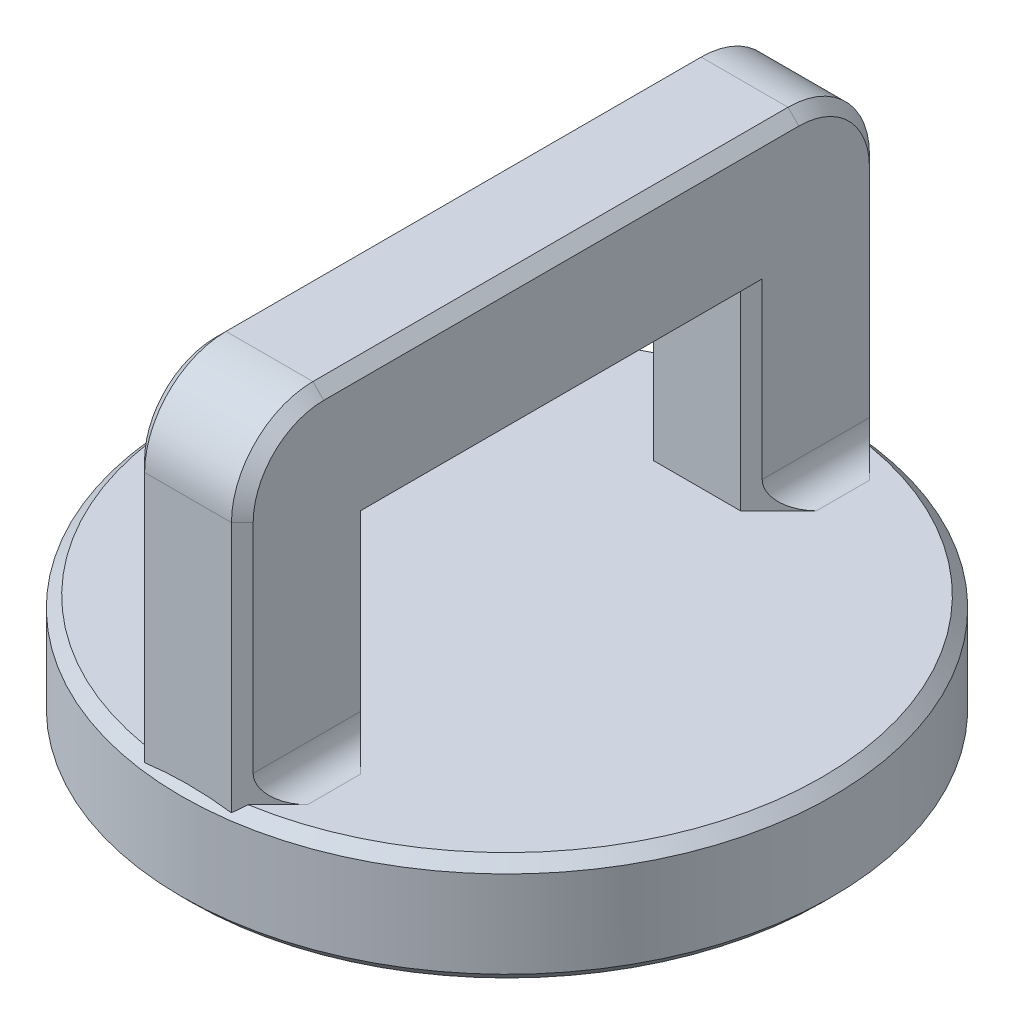
ISO-10303-21;
HEADER;
FILE_DESCRIPTION(('STEP AP214'),'2;1');
FILE_NAME('part.step','',(''),(''),'','','');
FILE_SCHEMA(('AUTOMOTIVE_DESIGN { 1 0 10303 214 1 1 1 1 }'));
ENDSEC;
DATA;
#1=APPLICATION_CONTEXT('core data for automotive mechanical design processes');
#2=APPLICATION_PROTOCOL_DEFINITION('international standard','automotive_design',2000,#1);
#3=PRODUCT_CONTEXT('',#1,'mechanical');
#4=PRODUCT('Part','Part','',(#3));
#5=PRODUCT_RELATED_PRODUCT_CATEGORY('part','',(#4));
#6=PRODUCT_DEFINITION_FORMATION('','',#4);
#7=PRODUCT_DEFINITION_CONTEXT('part definition',#1,'design');
#8=PRODUCT_DEFINITION('design','',#6,#7);
#9=PRODUCT_DEFINITION_SHAPE('','',#8);
#10=(LENGTH_UNIT() NAMED_UNIT(*) SI_UNIT(.MILLI.,.METRE.));
#11=(NAMED_UNIT(*) PLANE_ANGLE_UNIT() SI_UNIT($,.RADIAN.));
#12=(NAMED_UNIT(*) SI_UNIT($,.STERADIAN.) SOLID_ANGLE_UNIT());
#13=UNCERTAINTY_MEASURE_WITH_UNIT(LENGTH_MEASURE(1.E-05),#10,'distance_accuracy_value','');
#14=(GEOMETRIC_REPRESENTATION_CONTEXT(3) GLOBAL_UNCERTAINTY_ASSIGNED_CONTEXT((#13)) GLOBAL_UNIT_ASSIGNED_CONTEXT((#10,
#11,#12)) REPRESENTATION_CONTEXT('',''));
#15=CARTESIAN_POINT('',(0.,0.,0.));
#16=DIRECTION('',(0.,0.,1.));
#17=DIRECTION('',(1.,0.,0.));
#18=AXIS2_PLACEMENT_3D('',#15,#16,#17);
#19=CARTESIAN_POINT('',(0.,4.,0.));
#20=DIRECTION('',(0.,-1.,0.));
#21=DIRECTION('',(0.,0.,-1.));
#22=AXIS2_PLACEMENT_3D('',#19,#20,#21);
#23=CYLINDRICAL_SURFACE('',#22,12.);
#24=CARTESIAN_POINT('',(0.,3.6,0.));
#25=DIRECTION('',(0.,1.,0.));
#26=DIRECTION('',(0.,0.,1.));
#27=AXIS2_PLACEMENT_3D('',#24,#25,#26);
#28=CIRCLE('',#27,12.);
#29=CARTESIAN_POINT('',(0.,3.6,12.));
#30=VERTEX_POINT('',#29);
#31=EDGE_CURVE('E647',#30,#30,#28,.F.);
#32=ORIENTED_EDGE('',*,*,#31,.T.);
#33=EDGE_LOOP('',(#32));
#34=FACE_BOUND('',#33,.T.);
#35=CARTESIAN_POINT('',(0.,0.399999999999998,0.));
#36=DIRECTION('',(0.,1.,0.));
#37=DIRECTION('',(0.,0.,1.));
#38=AXIS2_PLACEMENT_3D('',#35,#36,#37);
#39=CIRCLE('',#38,12.);
#40=CARTESIAN_POINT('',(0.,0.399999999999998,12.));
#41=VERTEX_POINT('',#40);
#42=EDGE_CURVE('E639',#41,#41,#39,.T.);
#43=ORIENTED_EDGE('',*,*,#42,.T.);
#44=EDGE_LOOP('',(#43));
#45=FACE_BOUND('',#44,.T.);
#46=ADVANCED_FACE('F37',(#34,#45),#23,.T.);
#47=CARTESIAN_POINT('',(0.,4.,0.));
#48=DIRECTION('',(0.,1.,0.));
#49=DIRECTION('',(0.,0.,1.));
#50=AXIS2_PLACEMENT_3D('',#47,#48,#49);
#51=PLANE('',#50);
#52=DIRECTION('',(-0.707106781186546,0.,-0.707106781186549));
#53=VECTOR('',#52,1.);
#54=CARTESIAN_POINT('',(1.6,4.,-11.75));
#55=LINE('',#54,#53);
#56=CARTESIAN_POINT('',(1.90799097966031,4.,-11.4420090203397));
#57=VERTEX_POINT('',#56);
#58=CARTESIAN_POINT('',(3.,4.,-10.35));
#59=VERTEX_POINT('',#58);
#60=EDGE_CURVE('E506',#57,#59,#55,.F.);
#61=ORIENTED_EDGE('',*,*,#60,.T.);
#62=DIRECTION('',(0.,0.,-1.));
#63=VECTOR('',#62,1.);
#64=CARTESIAN_POINT('',(3.,4.,0.));
#65=LINE('',#64,#63);
#66=CARTESIAN_POINT('',(3.,4.,-8.4));
#67=VERTEX_POINT('',#66);
#68=EDGE_CURVE('E477',#59,#67,#65,.F.);
#69=ORIENTED_EDGE('',*,*,#68,.T.);
#70=DIRECTION('',(0.707106781186549,0.,-0.707106781186546));
#71=VECTOR('',#70,1.);
#72=CARTESIAN_POINT('',(2.,4.,-7.4));
#73=LINE('',#72,#71);
#74=CARTESIAN_POINT('',(1.6,4.,-7.));
#75=VERTEX_POINT('',#74);
#76=EDGE_CURVE('E503',#67,#75,#73,.F.);
#77=ORIENTED_EDGE('',*,*,#76,.T.);
#78=DIRECTION('',(-1.,0.,0.));
#79=VECTOR('',#78,1.);
#80=CARTESIAN_POINT('',(22.,4.,-7.));
#81=LINE('',#80,#79);
#82=CARTESIAN_POINT('',(-1.6,4.,-7.));
#83=VERTEX_POINT('',#82);
#84=EDGE_CURVE('E447',#75,#83,#81,.T.);
#85=ORIENTED_EDGE('',*,*,#84,.T.);
#86=DIRECTION('',(0.707106781186546,0.,0.707106781186549));
#87=VECTOR('',#86,1.);
#88=CARTESIAN_POINT('',(-1.6,4.,-7.));
#89=LINE('',#88,#87);
#90=CARTESIAN_POINT('',(-3.,4.,-8.40000000000001));
#91=VERTEX_POINT('',#90);
#92=EDGE_CURVE('E439',#83,#91,#89,.F.);
#93=ORIENTED_EDGE('',*,*,#92,.T.);
#94=DIRECTION('',(0.,0.,1.));
#95=VECTOR('',#94,1.);
#96=CARTESIAN_POINT('',(-3.,4.,0.));
#97=LINE('',#96,#95);
#98=CARTESIAN_POINT('',(-3.,4.,-10.35));
#99=VERTEX_POINT('',#98);
#100=EDGE_CURVE('E468',#91,#99,#97,.F.);
#101=ORIENTED_EDGE('',*,*,#100,.T.);
#102=DIRECTION('',(-0.707106781186546,0.,0.707106781186549));
#103=VECTOR('',#102,1.);
#104=CARTESIAN_POINT('',(-2.,4.,-11.35));
#105=LINE('',#104,#103);
#106=CARTESIAN_POINT('',(-1.90799097966031,4.,-11.4420090203397));
#107=VERTEX_POINT('',#106);
#108=EDGE_CURVE('E302',#99,#107,#105,.F.);
#109=ORIENTED_EDGE('',*,*,#108,.T.);
#110=CARTESIAN_POINT('',(0.,4.,0.));
#111=DIRECTION('',(0.,1.,0.));
#112=DIRECTION('',(0.,0.,1.));
#113=AXIS2_PLACEMENT_3D('',#110,#111,#112);
#114=CIRCLE('',#113,11.6);
#115=CARTESIAN_POINT('',(-1.9079909796603,4.,11.4420090203397));
#116=VERTEX_POINT('',#115);
#117=EDGE_CURVE('E646',#107,#116,#114,.T.);
#118=ORIENTED_EDGE('',*,*,#117,.T.);
#119=DIRECTION('',(0.707106781186544,0.,0.707106781186551));
#120=VECTOR('',#119,1.);
#121=CARTESIAN_POINT('',(-1.6,4.,11.75));
#122=LINE('',#121,#120);
#123=CARTESIAN_POINT('',(-3.,4.,10.35));
#124=VERTEX_POINT('',#123);
#125=EDGE_CURVE('E518',#116,#124,#122,.F.);
#126=ORIENTED_EDGE('',*,*,#125,.T.);
#127=DIRECTION('',(0.,0.,1.));
#128=VECTOR('',#127,1.);
#129=CARTESIAN_POINT('',(-3.,4.,0.));
#130=LINE('',#129,#128);
#131=CARTESIAN_POINT('',(-3.,4.,8.40000000000001));
#132=VERTEX_POINT('',#131);
#133=EDGE_CURVE('E471',#124,#132,#130,.F.);
#134=ORIENTED_EDGE('',*,*,#133,.T.);
#135=DIRECTION('',(-0.707106781186545,0.,0.70710678118655));
#136=VECTOR('',#135,1.);
#137=CARTESIAN_POINT('',(-1.6,4.,7.));
#138=LINE('',#137,#136);
#139=CARTESIAN_POINT('',(-1.6,4.,7.));
#140=VERTEX_POINT('',#139);
#141=EDGE_CURVE('E499',#132,#140,#138,.F.);
#142=ORIENTED_EDGE('',*,*,#141,.T.);
#143=DIRECTION('',(-1.,0.,0.));
#144=VECTOR('',#143,1.);
#145=CARTESIAN_POINT('',(22.,4.,7.));
#146=LINE('',#145,#144);
#147=CARTESIAN_POINT('',(1.6,4.,7.));
#148=VERTEX_POINT('',#147);
#149=EDGE_CURVE('E669',#148,#140,#146,.T.);
#150=ORIENTED_EDGE('',*,*,#149,.F.);
#151=DIRECTION('',(-0.707106781186547,0.,-0.707106781186548));
#152=VECTOR('',#151,1.);
#153=CARTESIAN_POINT('',(2.,4.,7.4));
#154=LINE('',#153,#152);
#155=CARTESIAN_POINT('',(3.,4.,8.4));
#156=VERTEX_POINT('',#155);
#157=EDGE_CURVE('E500',#148,#156,#154,.F.);
#158=ORIENTED_EDGE('',*,*,#157,.T.);
#159=DIRECTION('',(0.,0.,-1.));
#160=VECTOR('',#159,1.);
#161=CARTESIAN_POINT('',(3.,4.,0.));
#162=LINE('',#161,#160);
#163=CARTESIAN_POINT('',(3.,4.,10.35));
#164=VERTEX_POINT('',#163);
#165=EDGE_CURVE('E474',#156,#164,#162,.F.);
#166=ORIENTED_EDGE('',*,*,#165,.T.);
#167=DIRECTION('',(0.707106781186548,0.,-0.707106781186548));
#168=VECTOR('',#167,1.);
#169=CARTESIAN_POINT('',(2.,4.,11.35));
#170=LINE('',#169,#168);
#171=CARTESIAN_POINT('',(1.90799097966031,4.,11.4420090203397));
#172=VERTEX_POINT('',#171);
#173=EDGE_CURVE('E513',#164,#172,#170,.F.);
#174=ORIENTED_EDGE('',*,*,#173,.T.);
#175=CARTESIAN_POINT('',(0.,4.,0.));
#176=DIRECTION('',(0.,1.,0.));
#177=DIRECTION('',(0.,0.,1.));
#178=AXIS2_PLACEMENT_3D('',#175,#176,#177);
#179=CIRCLE('',#178,11.6);
#180=EDGE_CURVE('E644',#172,#57,#179,.T.);
#181=ORIENTED_EDGE('',*,*,#180,.T.);
#182=EDGE_LOOP('',(#61,#69,#77,#85,#93,#101,#109,#118,#126,#134,#142,#150,#158,#166,#174,#181));
#183=FACE_BOUND('',#182,.T.);
#184=ADVANCED_FACE('F384',(#183),#51,.T.);
#185=CARTESIAN_POINT('',(0.,0.,0.));
#186=DIRECTION('',(0.,1.,0.));
#187=DIRECTION('',(0.,0.,1.));
#188=AXIS2_PLACEMENT_3D('',#185,#186,#187);
#189=PLANE('',#188);
#190=CARTESIAN_POINT('',(0.,0.,0.));
#191=DIRECTION('',(0.,1.,0.));
#192=DIRECTION('',(0.,0.,1.));
#193=AXIS2_PLACEMENT_3D('',#190,#191,#192);
#194=CIRCLE('',#193,11.6);
#195=CARTESIAN_POINT('',(0.,0.,11.6));
#196=VERTEX_POINT('',#195);
#197=EDGE_CURVE('E635',#196,#196,#194,.F.);
#198=ORIENTED_EDGE('',*,*,#197,.T.);
#199=EDGE_LOOP('',(#198));
#200=FACE_BOUND('',#199,.T.);
#201=ADVANCED_FACE('F383',(#200),#189,.F.);
#202=CARTESIAN_POINT('',(-2.,16.,-11.75));
#203=DIRECTION('',(1.,0.,0.));
#204=DIRECTION('',(0.,0.,-1.));
#205=AXIS2_PLACEMENT_3D('',#202,#203,#204);
#206=PLANE('',#205);
#207=DIRECTION('',(0.,-1.,0.));
#208=VECTOR('',#207,1.);
#209=CARTESIAN_POINT('',(-2.,16.,7.4));
#210=LINE('',#209,#208);
#211=CARTESIAN_POINT('',(-2.,11.4,7.40000000000001));
#212=VERTEX_POINT('',#211);
#213=CARTESIAN_POINT('',(-2.,5.,7.40000000000001));
#214=VERTEX_POINT('',#213);
#215=EDGE_CURVE('E237',#212,#214,#210,.T.);
#216=ORIENTED_EDGE('',*,*,#215,.T.);
#217=DIRECTION('',(0.,0.,1.));
#218=VECTOR('',#217,1.);
#219=CARTESIAN_POINT('',(-2.,5.,-11.75));
#220=LINE('',#219,#218);
#221=CARTESIAN_POINT('',(-2.,5.,11.35));
#222=VERTEX_POINT('',#221);
#223=EDGE_CURVE('E481',#214,#222,#220,.T.);
#224=ORIENTED_EDGE('',*,*,#223,.T.);
#225=DIRECTION('',(0.,1.,0.));
#226=VECTOR('',#225,1.);
#227=CARTESIAN_POINT('',(-2.,16.,11.35));
#228=LINE('',#227,#226);
#229=CARTESIAN_POINT('',(-2.,13.,11.35));
#230=VERTEX_POINT('',#229);
#231=EDGE_CURVE('E248',#222,#230,#228,.T.);
#232=ORIENTED_EDGE('',*,*,#231,.T.);
#233=CARTESIAN_POINT('',(-2.,13.,8.75));
#234=DIRECTION('',(1.,0.,0.));
#235=DIRECTION('',(0.,0.,-1.));
#236=AXIS2_PLACEMENT_3D('',#233,#234,#235);
#237=CIRCLE('',#236,2.6);
#238=CARTESIAN_POINT('',(-2.,15.6,8.75));
#239=VERTEX_POINT('',#238);
#240=EDGE_CURVE('E244',#230,#239,#237,.F.);
#241=ORIENTED_EDGE('',*,*,#240,.T.);
#242=DIRECTION('',(0.,0.,-1.));
#243=VECTOR('',#242,1.);
#244=CARTESIAN_POINT('',(-2.,15.6,-8.75));
#245=LINE('',#244,#243);
#246=CARTESIAN_POINT('',(-2.,15.6,-8.75));
#247=VERTEX_POINT('',#246);
#248=EDGE_CURVE('E239',#239,#247,#245,.T.);
#249=ORIENTED_EDGE('',*,*,#248,.T.);
#250=CARTESIAN_POINT('',(-2.,13.,-8.75));
#251=DIRECTION('',(1.,0.,0.));
#252=DIRECTION('',(0.,0.,-1.));
#253=AXIS2_PLACEMENT_3D('',#250,#251,#252);
#254=CIRCLE('',#253,2.6);
#255=CARTESIAN_POINT('',(-2.,13.,-11.35));
#256=VERTEX_POINT('',#255);
#257=EDGE_CURVE('E246',#247,#256,#254,.F.);
#258=ORIENTED_EDGE('',*,*,#257,.T.);
#259=DIRECTION('',(0.,-1.,0.));
#260=VECTOR('',#259,1.);
#261=CARTESIAN_POINT('',(-2.,16.,-11.35));
#262=LINE('',#261,#260);
#263=CARTESIAN_POINT('',(-2.,5.,-11.35));
#264=VERTEX_POINT('',#263);
#265=EDGE_CURVE('E250',#256,#264,#262,.T.);
#266=ORIENTED_EDGE('',*,*,#265,.T.);
#267=DIRECTION('',(0.,0.,1.));
#268=VECTOR('',#267,1.);
#269=CARTESIAN_POINT('',(-2.,5.,-11.75));
#270=LINE('',#269,#268);
#271=CARTESIAN_POINT('',(-2.,5.,-7.4));
#272=VERTEX_POINT('',#271);
#273=EDGE_CURVE('E219',#264,#272,#270,.T.);
#274=ORIENTED_EDGE('',*,*,#273,.T.);
#275=DIRECTION('',(0.,1.,0.));
#276=VECTOR('',#275,1.);
#277=CARTESIAN_POINT('',(-2.,16.,-7.4));
#278=LINE('',#277,#276);
#279=CARTESIAN_POINT('',(-2.,11.4,-7.4));
#280=VERTEX_POINT('',#279);
#281=EDGE_CURVE('E212',#272,#280,#278,.T.);
#282=ORIENTED_EDGE('',*,*,#281,.T.);
#283=DIRECTION('',(0.,0.,1.));
#284=VECTOR('',#283,1.);
#285=CARTESIAN_POINT('',(-2.,11.4,-11.75));
#286=LINE('',#285,#284);
#287=EDGE_CURVE('E216',#280,#212,#286,.T.);
#288=ORIENTED_EDGE('',*,*,#287,.T.);
#289=EDGE_LOOP('',(#216,#224,#232,#241,#249,#258,#266,#274,#282,#288));
#290=FACE_BOUND('',#289,.T.);
#291=ADVANCED_FACE('F214',(#290),#206,.F.);
#292=CARTESIAN_POINT('',(-2.,16.,11.75));
#293=DIRECTION('',(0.,0.,-1.));
#294=DIRECTION('',(-1.,0.,0.));
#295=AXIS2_PLACEMENT_3D('',#292,#293,#294);
#296=PLANE('',#295);
#297=DIRECTION('',(1.,0.,0.));
#298=VECTOR('',#297,1.);
#299=CARTESIAN_POINT('',(-2.,13.,11.75));
#300=LINE('',#299,#298);
#301=CARTESIAN_POINT('',(1.6,13.,11.75));
#302=VERTEX_POINT('',#301);
#303=CARTESIAN_POINT('',(-1.6,13.,11.75));
#304=VERTEX_POINT('',#303);
#305=EDGE_CURVE('E415',#302,#304,#300,.F.);
#306=ORIENTED_EDGE('',*,*,#305,.T.);
#307=DIRECTION('',(0.,-1.,0.));
#308=VECTOR('',#307,1.);
#309=CARTESIAN_POINT('',(-1.6,16.,11.75));
#310=LINE('',#309,#308);
#311=CARTESIAN_POINT('',(-1.6,3.74156418409241,11.75));
#312=VERTEX_POINT('',#311);
#313=EDGE_CURVE('E258',#304,#312,#310,.T.);
#314=ORIENTED_EDGE('',*,*,#313,.T.);
#315=CARTESIAN_POINT('',(-2.,3.68100255893979,11.75));
#316=CARTESIAN_POINT('',(-1.85360198840346,3.70557192127635,11.75));
#317=CARTESIAN_POINT('',(-1.70678381389868,3.72758153810895,11.75));
#318=CARTESIAN_POINT('',(-1.41244071645743,3.76631035297485,11.75));
#319=CARTESIAN_POINT('',(-1.26491573978375,3.78302914206022,11.75));
#320=CARTESIAN_POINT('',(-0.82146209920867,3.82499272518919,11.75));
#321=CARTESIAN_POINT('',(-0.524707290062936,3.84203580663085,11.75));
#322=CARTESIAN_POINT('',(0.0656232447160099,3.85348065017774,11.75));
#323=CARTESIAN_POINT('',(0.359194163305538,3.84815290788293,11.75));
#324=CARTESIAN_POINT('',(0.944999599016471,3.81568510032264,11.75));
#325=CARTESIAN_POINT('',(1.23723475795835,3.78855693894607,11.75));
#326=CARTESIAN_POINT('',(1.60685592880795,3.74089588109145,11.75));
#327=CARTESIAN_POINT('',(1.68556281533893,3.72997180538805,11.75));
#328=CARTESIAN_POINT('',(1.84288577430954,3.7066119951146,11.75));
#329=CARTESIAN_POINT('',(1.92150147821086,3.69417377751516,11.75));
#330=CARTESIAN_POINT('',(2.,3.68100255893979,11.75));
#331=B_SPLINE_CURVE_WITH_KNOTS('',3,(#315,#316,#317,#318,#319,#320,#321,#322,#323,#324,#325,
#326,#327,#328,#329,#330),.UNSPECIFIED.,.F.,.F.,(4,2,2,2,2,2,2,4),(0.,0.445291792412324,
0.890617994697423,1.78142996879038,2.66150195239136,3.54109370823164,3.77946970153538,
4.01824200941105),.UNSPECIFIED.);
#332=CARTESIAN_POINT('',(1.6,3.74156418409241,11.75));
#333=VERTEX_POINT('',#332);
#334=EDGE_CURVE('E351',#312,#333,#331,.T.);
#335=ORIENTED_EDGE('',*,*,#334,.T.);
#336=DIRECTION('',(0.,1.,0.));
#337=VECTOR('',#336,1.);
#338=CARTESIAN_POINT('',(1.6,16.,11.75));
#339=LINE('',#338,#337);
#340=EDGE_CURVE('E256',#333,#302,#339,.T.);
#341=ORIENTED_EDGE('',*,*,#340,.T.);
#342=EDGE_LOOP('',(#306,#314,#335,#341));
#343=FACE_BOUND('',#342,.T.);
#344=ADVANCED_FACE('F375',(#343),#296,.F.);
#345=CARTESIAN_POINT('',(2.,16.,-11.75));
#346=DIRECTION('',(-1.,0.,0.));
#347=DIRECTION('',(0.,0.,1.));
#348=AXIS2_PLACEMENT_3D('',#345,#346,#347);
#349=PLANE('',#348);
#350=DIRECTION('',(0.,-1.,0.));
#351=VECTOR('',#350,1.);
#352=CARTESIAN_POINT('',(2.,16.,-7.4));
#353=LINE('',#352,#351);
#354=CARTESIAN_POINT('',(2.,11.4,-7.4));
#355=VERTEX_POINT('',#354);
#356=CARTESIAN_POINT('',(2.,5.,-7.4));
#357=VERTEX_POINT('',#356);
#358=EDGE_CURVE('E276',#355,#357,#353,.T.);
#359=ORIENTED_EDGE('',*,*,#358,.T.);
#360=DIRECTION('',(0.,0.,-1.));
#361=VECTOR('',#360,1.);
#362=CARTESIAN_POINT('',(2.,5.,-11.75));
#363=LINE('',#362,#361);
#364=CARTESIAN_POINT('',(2.,5.,-11.35));
#365=VERTEX_POINT('',#364);
#366=EDGE_CURVE('E465',#357,#365,#363,.T.);
#367=ORIENTED_EDGE('',*,*,#366,.T.);
#368=DIRECTION('',(0.,1.,0.));
#369=VECTOR('',#368,1.);
#370=CARTESIAN_POINT('',(2.,16.,-11.35));
#371=LINE('',#370,#369);
#372=CARTESIAN_POINT('',(2.,13.,-11.35));
#373=VERTEX_POINT('',#372);
#374=EDGE_CURVE('E285',#365,#373,#371,.T.);
#375=ORIENTED_EDGE('',*,*,#374,.T.);
#376=CARTESIAN_POINT('',(2.,13.,-8.75));
#377=DIRECTION('',(-1.,0.,0.));
#378=DIRECTION('',(0.,0.,1.));
#379=AXIS2_PLACEMENT_3D('',#376,#377,#378);
#380=CIRCLE('',#379,2.6);
#381=CARTESIAN_POINT('',(2.,15.6,-8.75));
#382=VERTEX_POINT('',#381);
#383=EDGE_CURVE('E281',#373,#382,#380,.F.);
#384=ORIENTED_EDGE('',*,*,#383,.T.);
#385=DIRECTION('',(0.,0.,1.));
#386=VECTOR('',#385,1.);
#387=CARTESIAN_POINT('',(2.,15.6,8.75));
#388=LINE('',#387,#386);
#389=CARTESIAN_POINT('',(2.,15.6,8.75));
#390=VERTEX_POINT('',#389);
#391=EDGE_CURVE('E279',#382,#390,#388,.T.);
#392=ORIENTED_EDGE('',*,*,#391,.T.);
#393=CARTESIAN_POINT('',(2.,13.,8.75));
#394=DIRECTION('',(-1.,0.,0.));
#395=DIRECTION('',(0.,0.,1.));
#396=AXIS2_PLACEMENT_3D('',#393,#394,#395);
#397=CIRCLE('',#396,2.6);
#398=CARTESIAN_POINT('',(2.,13.,11.35));
#399=VERTEX_POINT('',#398);
#400=EDGE_CURVE('E283',#390,#399,#397,.F.);
#401=ORIENTED_EDGE('',*,*,#400,.T.);
#402=DIRECTION('',(0.,-1.,0.));
#403=VECTOR('',#402,1.);
#404=CARTESIAN_POINT('',(2.,16.,11.35));
#405=LINE('',#404,#403);
#406=CARTESIAN_POINT('',(2.,5.,11.35));
#407=VERTEX_POINT('',#406);
#408=EDGE_CURVE('E287',#399,#407,#405,.T.);
#409=ORIENTED_EDGE('',*,*,#408,.T.);
#410=DIRECTION('',(0.,0.,-1.));
#411=VECTOR('',#410,1.);
#412=CARTESIAN_POINT('',(2.,5.,-11.75));
#413=LINE('',#412,#411);
#414=CARTESIAN_POINT('',(2.,5.,7.4));
#415=VERTEX_POINT('',#414);
#416=EDGE_CURVE('E462',#407,#415,#413,.T.);
#417=ORIENTED_EDGE('',*,*,#416,.T.);
#418=DIRECTION('',(0.,1.,0.));
#419=VECTOR('',#418,1.);
#420=CARTESIAN_POINT('',(2.,16.,7.4));
#421=LINE('',#420,#419);
#422=CARTESIAN_POINT('',(2.,11.4,7.4));
#423=VERTEX_POINT('',#422);
#424=EDGE_CURVE('E272',#415,#423,#421,.T.);
#425=ORIENTED_EDGE('',*,*,#424,.T.);
#426=DIRECTION('',(0.,0.,-1.));
#427=VECTOR('',#426,1.);
#428=CARTESIAN_POINT('',(2.,11.4,-11.75));
#429=LINE('',#428,#427);
#430=EDGE_CURVE('E274',#423,#355,#429,.T.);
#431=ORIENTED_EDGE('',*,*,#430,.T.);
#432=EDGE_LOOP('',(#359,#367,#375,#384,#392,#401,#409,#417,#425,#431));
#433=FACE_BOUND('',#432,.T.);
#434=ADVANCED_FACE('F371',(#433),#349,.F.);
#435=CARTESIAN_POINT('',(-2.,16.,-11.75));
#436=DIRECTION('',(0.,0.,1.));
#437=DIRECTION('',(1.,0.,0.));
#438=AXIS2_PLACEMENT_3D('',#435,#436,#437);
#439=PLANE('',#438);
#440=CARTESIAN_POINT('',(2.,3.68100255893979,-11.75));
#441=CARTESIAN_POINT('',(1.85360198840346,3.70557192127635,-11.75));
#442=CARTESIAN_POINT('',(1.70678381389868,3.72758153810895,-11.75));
#443=CARTESIAN_POINT('',(1.41244071645742,3.76631035297485,-11.75));
#444=CARTESIAN_POINT('',(1.26491573978375,3.78302914206022,-11.75));
#445=CARTESIAN_POINT('',(0.821462099208669,3.82499272518919,-11.75));
#446=CARTESIAN_POINT('',(0.524707290062936,3.84203580663085,-11.75));
#447=CARTESIAN_POINT('',(-0.0656232447160104,3.85348065017774,-11.75));
#448=CARTESIAN_POINT('',(-0.359194163305538,3.84815290788293,-11.75));
#449=CARTESIAN_POINT('',(-0.944999599016471,3.81568510032264,-11.75));
#450=CARTESIAN_POINT('',(-1.23723475795835,3.78855693894607,-11.75));
#451=CARTESIAN_POINT('',(-1.60685592880795,3.74089588109145,-11.75));
#452=CARTESIAN_POINT('',(-1.68556281533893,3.72997180538805,-11.75));
#453=CARTESIAN_POINT('',(-1.84288577430954,3.7066119951146,-11.75));
#454=CARTESIAN_POINT('',(-1.92150147821086,3.69417377751516,-11.75));
#455=CARTESIAN_POINT('',(-2.,3.68100255893979,-11.75));
#456=B_SPLINE_CURVE_WITH_KNOTS('',3,(#440,#441,#442,#443,#444,#445,#446,#447,#448,#449,#450,
#451,#452,#453,#454,#455),.UNSPECIFIED.,.F.,.F.,(4,2,2,2,2,2,2,4),(0.,0.445291792412324,
0.890617994697423,1.78142996879038,2.66150195239136,3.54109370823164,3.77946970153538,
4.01824200941105),.UNSPECIFIED.);
#457=CARTESIAN_POINT('',(1.6,3.74156418409241,-11.75));
#458=VERTEX_POINT('',#457);
#459=CARTESIAN_POINT('',(-1.6,3.74156418409241,-11.75));
#460=VERTEX_POINT('',#459);
#461=EDGE_CURVE('E222',#458,#460,#456,.T.);
#462=ORIENTED_EDGE('',*,*,#461,.T.);
#463=DIRECTION('',(0.,1.,0.));
#464=VECTOR('',#463,1.);
#465=CARTESIAN_POINT('',(-1.6,16.,-11.75));
#466=LINE('',#465,#464);
#467=CARTESIAN_POINT('',(-1.6,13.,-11.75));
#468=VERTEX_POINT('',#467);
#469=EDGE_CURVE('E254',#460,#468,#466,.T.);
#470=ORIENTED_EDGE('',*,*,#469,.T.);
#471=DIRECTION('',(-1.,0.,0.));
#472=VECTOR('',#471,1.);
#473=CARTESIAN_POINT('',(2.,13.,-11.75));
#474=LINE('',#473,#472);
#475=CARTESIAN_POINT('',(1.6,13.,-11.75));
#476=VERTEX_POINT('',#475);
#477=EDGE_CURVE('E409',#468,#476,#474,.F.);
#478=ORIENTED_EDGE('',*,*,#477,.T.);
#479=DIRECTION('',(0.,-1.,0.));
#480=VECTOR('',#479,1.);
#481=CARTESIAN_POINT('',(1.6,16.,-11.75));
#482=LINE('',#481,#480);
#483=EDGE_CURVE('E252',#476,#458,#482,.T.);
#484=ORIENTED_EDGE('',*,*,#483,.T.);
#485=EDGE_LOOP('',(#462,#470,#478,#484));
#486=FACE_BOUND('',#485,.T.);
#487=ADVANCED_FACE('F365',(#486),#439,.F.);
#488=CARTESIAN_POINT('',(0.,16.,0.));
#489=DIRECTION('',(0.,1.,0.));
#490=DIRECTION('',(0.,0.,1.));
#491=AXIS2_PLACEMENT_3D('',#488,#489,#490);
#492=PLANE('',#491);
#493=DIRECTION('',(-1.,0.,0.));
#494=VECTOR('',#493,1.);
#495=CARTESIAN_POINT('',(-2.,16.,-8.75));
#496=LINE('',#495,#494);
#497=CARTESIAN_POINT('',(1.6,16.,-8.75));
#498=VERTEX_POINT('',#497);
#499=CARTESIAN_POINT('',(-1.6,16.,-8.75));
#500=VERTEX_POINT('',#499);
#501=EDGE_CURVE('E416',#498,#500,#496,.T.);
#502=ORIENTED_EDGE('',*,*,#501,.T.);
#503=DIRECTION('',(0.,0.,1.));
#504=VECTOR('',#503,1.);
#505=CARTESIAN_POINT('',(-1.6,16.,8.75));
#506=LINE('',#505,#504);
#507=CARTESIAN_POINT('',(-1.6,16.,8.75));
#508=VERTEX_POINT('',#507);
#509=EDGE_CURVE('E270',#500,#508,#506,.T.);
#510=ORIENTED_EDGE('',*,*,#509,.T.);
#511=DIRECTION('',(1.,0.,0.));
#512=VECTOR('',#511,1.);
#513=CARTESIAN_POINT('',(2.,16.,8.75));
#514=LINE('',#513,#512);
#515=CARTESIAN_POINT('',(1.6,16.,8.75));
#516=VERTEX_POINT('',#515);
#517=EDGE_CURVE('E630',#508,#516,#514,.T.);
#518=ORIENTED_EDGE('',*,*,#517,.T.);
#519=DIRECTION('',(0.,0.,-1.));
#520=VECTOR('',#519,1.);
#521=CARTESIAN_POINT('',(1.6,16.,-8.75));
#522=LINE('',#521,#520);
#523=EDGE_CURVE('E268',#516,#498,#522,.T.);
#524=ORIENTED_EDGE('',*,*,#523,.T.);
#525=EDGE_LOOP('',(#502,#510,#518,#524));
#526=FACE_BOUND('',#525,.T.);
#527=ADVANCED_FACE('F370',(#526),#492,.T.);
#528=CARTESIAN_POINT('',(22.,11.,-7.));
#529=DIRECTION('',(0.,0.,-1.));
#530=DIRECTION('',(0.,1.,0.));
#531=AXIS2_PLACEMENT_3D('',#528,#529,#530);
#532=PLANE('',#531);
#533=ORIENTED_EDGE('',*,*,#84,.F.);
#534=DIRECTION('',(0.,1.,0.));
#535=VECTOR('',#534,1.);
#536=CARTESIAN_POINT('',(1.6,11.,-7.));
#537=LINE('',#536,#535);
#538=CARTESIAN_POINT('',(1.6,11.,-7.));
#539=VERTEX_POINT('',#538);
#540=EDGE_CURVE('E291',#75,#539,#537,.T.);
#541=ORIENTED_EDGE('',*,*,#540,.T.);
#542=DIRECTION('',(-1.,0.,0.));
#543=VECTOR('',#542,1.);
#544=CARTESIAN_POINT('',(22.,11.,-7.));
#545=LINE('',#544,#543);
#546=CARTESIAN_POINT('',(-1.6,11.,-7.));
#547=VERTEX_POINT('',#546);
#548=EDGE_CURVE('E681',#539,#547,#545,.T.);
#549=ORIENTED_EDGE('',*,*,#548,.T.);
#550=DIRECTION('',(0.,-1.,0.));
#551=VECTOR('',#550,1.);
#552=CARTESIAN_POINT('',(-1.6,11.,-7.));
#553=LINE('',#552,#551);
#554=EDGE_CURVE('E229',#547,#83,#553,.T.);
#555=ORIENTED_EDGE('',*,*,#554,.T.);
#556=EDGE_LOOP('',(#533,#541,#549,#555));
#557=FACE_BOUND('',#556,.T.);
#558=ADVANCED_FACE('F666',(#557),#532,.F.);
#559=CARTESIAN_POINT('',(22.,11.,-7.));
#560=DIRECTION('',(0.,1.,0.));
#561=DIRECTION('',(0.,0.,1.));
#562=AXIS2_PLACEMENT_3D('',#559,#560,#561);
#563=PLANE('',#562);
#564=ORIENTED_EDGE('',*,*,#548,.F.);
#565=DIRECTION('',(0.,0.,1.));
#566=VECTOR('',#565,1.);
#567=CARTESIAN_POINT('',(1.6,11.,-7.));
#568=LINE('',#567,#566);
#569=CARTESIAN_POINT('',(1.6,11.,7.));
#570=VERTEX_POINT('',#569);
#571=EDGE_CURVE('E295',#539,#570,#568,.T.);
#572=ORIENTED_EDGE('',*,*,#571,.T.);
#573=DIRECTION('',(-1.,0.,0.));
#574=VECTOR('',#573,1.);
#575=CARTESIAN_POINT('',(22.,11.,7.));
#576=LINE('',#575,#574);
#577=CARTESIAN_POINT('',(-1.6,11.,7.));
#578=VERTEX_POINT('',#577);
#579=EDGE_CURVE('E680',#570,#578,#576,.T.);
#580=ORIENTED_EDGE('',*,*,#579,.T.);
#581=DIRECTION('',(0.,0.,-1.));
#582=VECTOR('',#581,1.);
#583=CARTESIAN_POINT('',(-1.6,11.,-7.));
#584=LINE('',#583,#582);
#585=EDGE_CURVE('E293',#578,#547,#584,.T.);
#586=ORIENTED_EDGE('',*,*,#585,.T.);
#587=EDGE_LOOP('',(#564,#572,#580,#586));
#588=FACE_BOUND('',#587,.T.);
#589=ADVANCED_FACE('F679',(#588),#563,.F.);
#590=CARTESIAN_POINT('',(22.,11.,7.));
#591=DIRECTION('',(0.,0.,1.));
#592=DIRECTION('',(0.,-1.,0.));
#593=AXIS2_PLACEMENT_3D('',#590,#591,#592);
#594=PLANE('',#593);
#595=ORIENTED_EDGE('',*,*,#579,.F.);
#596=DIRECTION('',(0.,-1.,0.));
#597=VECTOR('',#596,1.);
#598=CARTESIAN_POINT('',(1.6,11.,7.));
#599=LINE('',#598,#597);
#600=EDGE_CURVE('E300',#570,#148,#599,.T.);
#601=ORIENTED_EDGE('',*,*,#600,.T.);
#602=ORIENTED_EDGE('',*,*,#149,.T.);
#603=DIRECTION('',(0.,1.,0.));
#604=VECTOR('',#603,1.);
#605=CARTESIAN_POINT('',(-1.6,11.,7.));
#606=LINE('',#605,#604);
#607=EDGE_CURVE('E297',#140,#578,#606,.T.);
#608=ORIENTED_EDGE('',*,*,#607,.T.);
#609=EDGE_LOOP('',(#595,#601,#602,#608));
#610=FACE_BOUND('',#609,.T.);
#611=ADVANCED_FACE('F399',(#610),#594,.F.);
#612=CARTESIAN_POINT('',(0.,0.399999999999998,0.));
#613=DIRECTION('',(0.,1.,0.));
#614=DIRECTION('',(0.,0.,1.));
#615=AXIS2_PLACEMENT_3D('',#612,#613,#614);
#616=CONICAL_SURFACE('',#615,12.,0.78539816339745);
#617=ORIENTED_EDGE('',*,*,#197,.F.);
#618=EDGE_LOOP('',(#617));
#619=FACE_BOUND('',#618,.T.);
#620=ORIENTED_EDGE('',*,*,#42,.F.);
#621=EDGE_LOOP('',(#620));
#622=FACE_BOUND('',#621,.T.);
#623=ADVANCED_FACE('F394',(#619,#622),#616,.T.);
#624=CARTESIAN_POINT('',(0.,13.,-8.75));
#625=DIRECTION('',(1.,0.,0.));
#626=DIRECTION('',(0.,0.,-1.));
#627=AXIS2_PLACEMENT_3D('',#624,#625,#626);
#628=CYLINDRICAL_SURFACE('',#627,3.);
#629=ORIENTED_EDGE('',*,*,#477,.F.);
#630=CARTESIAN_POINT('',(-1.6,13.,-8.75));
#631=DIRECTION('',(1.,0.,0.));
#632=DIRECTION('',(0.,0.,-1.));
#633=AXIS2_PLACEMENT_3D('',#630,#631,#632);
#634=CIRCLE('',#633,3.);
#635=EDGE_CURVE('E262',#468,#500,#634,.T.);
#636=ORIENTED_EDGE('',*,*,#635,.T.);
#637=ORIENTED_EDGE('',*,*,#501,.F.);
#638=CARTESIAN_POINT('',(1.6,13.,-8.75));
#639=DIRECTION('',(-1.,0.,0.));
#640=DIRECTION('',(0.,0.,1.));
#641=AXIS2_PLACEMENT_3D('',#638,#639,#640);
#642=CIRCLE('',#641,3.);
#643=EDGE_CURVE('E260',#498,#476,#642,.T.);
#644=ORIENTED_EDGE('',*,*,#643,.T.);
#645=EDGE_LOOP('',(#629,#636,#637,#644));
#646=FACE_BOUND('',#645,.T.);
#647=ADVANCED_FACE('F398',(#646),#628,.T.);
#648=CARTESIAN_POINT('',(0.,13.,8.75));
#649=DIRECTION('',(-1.,0.,0.));
#650=DIRECTION('',(0.,0.,1.));
#651=AXIS2_PLACEMENT_3D('',#648,#649,#650);
#652=CYLINDRICAL_SURFACE('',#651,3.);
#653=ORIENTED_EDGE('',*,*,#517,.F.);
#654=CARTESIAN_POINT('',(-1.6,13.,8.75));
#655=DIRECTION('',(1.,0.,0.));
#656=DIRECTION('',(0.,0.,-1.));
#657=AXIS2_PLACEMENT_3D('',#654,#655,#656);
#658=CIRCLE('',#657,3.);
#659=EDGE_CURVE('E266',#508,#304,#658,.T.);
#660=ORIENTED_EDGE('',*,*,#659,.T.);
#661=ORIENTED_EDGE('',*,*,#305,.F.);
#662=CARTESIAN_POINT('',(1.6,13.,8.75));
#663=DIRECTION('',(-1.,0.,0.));
#664=DIRECTION('',(0.,0.,1.));
#665=AXIS2_PLACEMENT_3D('',#662,#663,#664);
#666=CIRCLE('',#665,3.);
#667=EDGE_CURVE('E264',#302,#516,#666,.T.);
#668=ORIENTED_EDGE('',*,*,#667,.T.);
#669=EDGE_LOOP('',(#653,#660,#661,#668));
#670=FACE_BOUND('',#669,.T.);
#671=ADVANCED_FACE('F334',(#670),#652,.T.);
#672=CARTESIAN_POINT('',(0.,4.,0.));
#673=DIRECTION('',(0.,-1.,0.));
#674=DIRECTION('',(0.,0.,-1.));
#675=AXIS2_PLACEMENT_3D('',#672,#673,#674);
#676=CONICAL_SURFACE('',#675,11.6,0.785398163397453);
#677=ORIENTED_EDGE('',*,*,#31,.F.);
#678=EDGE_LOOP('',(#677));
#679=FACE_BOUND('',#678,.T.);
#680=ORIENTED_EDGE('',*,*,#334,.F.);
#681=CARTESIAN_POINT('',(-1.6,3.74156418409241,11.75));
#682=CARTESIAN_POINT('',(-1.65106079858088,3.78528278745019,11.6989392014191));
#683=CARTESIAN_POINT('',(-1.70225710721559,3.82867840249464,11.6477428927844));
#684=CARTESIAN_POINT('',(-1.80492076698414,3.91482367474562,11.5450792330159));
#685=CARTESIAN_POINT('',(-1.85638811823619,3.95757333167036,11.4936118817638));
#686=CARTESIAN_POINT('',(-1.9079909796603,4.,11.4420090203397));
#687=B_SPLINE_CURVE_WITH_KNOTS('',3,(#681,#682,#683,#684,#685,#686),.UNSPECIFIED.,.F.,.F.,(4,2,
4),(0.,0.253234537467841,0.506469185399152),.UNSPECIFIED.);
#688=EDGE_CURVE('E313',#312,#116,#687,.T.);
#689=ORIENTED_EDGE('',*,*,#688,.T.);
#690=ORIENTED_EDGE('',*,*,#117,.F.);
#691=CARTESIAN_POINT('',(-1.90799097966031,4.,-11.4420090203397));
#692=CARTESIAN_POINT('',(-1.8563881182362,3.95757333167036,-11.4936118817638));
#693=CARTESIAN_POINT('',(-1.80492076698414,3.91482367474562,-11.5450792330159));
#694=CARTESIAN_POINT('',(-1.70225710721559,3.82867840249464,-11.6477428927844));
#695=CARTESIAN_POINT('',(-1.65106079858088,3.78528278745019,-11.6989392014191));
#696=CARTESIAN_POINT('',(-1.6,3.74156418409241,-11.75));
#697=B_SPLINE_CURVE_WITH_KNOTS('',3,(#691,#692,#693,#694,#695,#696),.UNSPECIFIED.,.F.,.F.,(4,2,
4),(0.,0.25323464793131,0.506469185399153),.UNSPECIFIED.);
#698=EDGE_CURVE('E305',#107,#460,#697,.T.);
#699=ORIENTED_EDGE('',*,*,#698,.T.);
#700=ORIENTED_EDGE('',*,*,#461,.F.);
#701=CARTESIAN_POINT('',(1.6,3.74156418409241,-11.75));
#702=CARTESIAN_POINT('',(1.65106079858088,3.78528278745019,-11.6989392014191));
#703=CARTESIAN_POINT('',(1.7022571072156,3.82867840249464,-11.6477428927844));
#704=CARTESIAN_POINT('',(1.80492076698414,3.91482367474562,-11.5450792330159));
#705=CARTESIAN_POINT('',(1.8563881182362,3.95757333167036,-11.4936118817638));
#706=CARTESIAN_POINT('',(1.90799097966031,4.,-11.4420090203397));
#707=B_SPLINE_CURVE_WITH_KNOTS('',3,(#701,#702,#703,#704,#705,#706),.UNSPECIFIED.,.F.,.F.,(4,2,
4),(0.,0.253234537467844,0.506469185399155),.UNSPECIFIED.);
#708=EDGE_CURVE('E340',#458,#57,#707,.T.);
#709=ORIENTED_EDGE('',*,*,#708,.T.);
#710=ORIENTED_EDGE('',*,*,#180,.F.);
#711=CARTESIAN_POINT('',(1.90799097966031,4.,11.4420090203397));
#712=CARTESIAN_POINT('',(1.8563881182362,3.95757333167036,11.4936118817638));
#713=CARTESIAN_POINT('',(1.80492076698414,3.91482367474562,11.5450792330159));
#714=CARTESIAN_POINT('',(1.7022571072156,3.82867840249464,11.6477428927844));
#715=CARTESIAN_POINT('',(1.65106079858088,3.78528278745019,11.6989392014191));
#716=CARTESIAN_POINT('',(1.6,3.74156418409241,11.75));
#717=B_SPLINE_CURVE_WITH_KNOTS('',3,(#711,#712,#713,#714,#715,#716),.UNSPECIFIED.,.F.,.F.,(4,2,
4),(0.,0.253234647931311,0.506469185399155),.UNSPECIFIED.);
#718=EDGE_CURVE('E509',#172,#333,#717,.T.);
#719=ORIENTED_EDGE('',*,*,#718,.T.);
#720=EDGE_LOOP('',(#680,#689,#690,#699,#700,#709,#710,#719));
#721=FACE_BOUND('',#720,.T.);
#722=ADVANCED_FACE('F325',(#679,#721),#676,.T.);
#723=CARTESIAN_POINT('',(-1.6,16.,11.75));
#724=DIRECTION('',(0.707106781186551,0.,-0.707106781186544));
#725=DIRECTION('',(0.,-1.,0.));
#726=AXIS2_PLACEMENT_3D('',#723,#724,#725);
#727=PLANE('',#726);
#728=ORIENTED_EDGE('',*,*,#688,.F.);
#729=ORIENTED_EDGE('',*,*,#313,.F.);
#730=DIRECTION('',(0.707106781186544,0.,0.707106781186551));
#731=VECTOR('',#730,1.);
#732=CARTESIAN_POINT('',(-2.,13.,11.35));
#733=LINE('',#732,#731);
#734=EDGE_CURVE('E444',#230,#304,#733,.T.);
#735=ORIENTED_EDGE('',*,*,#734,.F.);
#736=ORIENTED_EDGE('',*,*,#231,.F.);
#737=CARTESIAN_POINT('',(-3.,5.,10.35));
#738=DIRECTION('',(0.707106781186551,0.,-0.707106781186544));
#739=DIRECTION('',(0.707106781186544,0.,0.707106781186551));
#740=AXIS2_PLACEMENT_3D('',#737,#738,#739);
#741=ELLIPSE('',#740,1.4142135623731,1.);
#742=EDGE_CURVE('E52',#222,#124,#741,.T.);
#743=ORIENTED_EDGE('',*,*,#742,.T.);
#744=ORIENTED_EDGE('',*,*,#125,.F.);
#745=EDGE_LOOP('',(#728,#729,#735,#736,#743,#744));
#746=FACE_BOUND('',#745,.T.);
#747=ADVANCED_FACE('F333',(#746),#727,.F.);
#748=CARTESIAN_POINT('',(-2.,13.,8.75));
#749=DIRECTION('',(1.,0.,0.));
#750=DIRECTION('',(0.,0.,-1.));
#751=AXIS2_PLACEMENT_3D('',#748,#749,#750);
#752=CONICAL_SURFACE('',#751,2.6,0.785398163397452);
#753=ORIENTED_EDGE('',*,*,#734,.T.);
#754=ORIENTED_EDGE('',*,*,#659,.F.);
#755=DIRECTION('',(0.707106781186546,0.707106781186549,0.));
#756=VECTOR('',#755,1.);
#757=CARTESIAN_POINT('',(-2.,15.6,8.75));
#758=LINE('',#757,#756);
#759=EDGE_CURVE('E433',#239,#508,#758,.T.);
#760=ORIENTED_EDGE('',*,*,#759,.F.);
#761=ORIENTED_EDGE('',*,*,#240,.F.);
#762=EDGE_LOOP('',(#753,#754,#760,#761));
#763=FACE_BOUND('',#762,.T.);
#764=ADVANCED_FACE('F622',(#763),#752,.T.);
#765=CARTESIAN_POINT('',(-1.6,16.,0.));
#766=DIRECTION('',(-0.707106781186549,0.707106781186546,0.));
#767=DIRECTION('',(0.,0.,-1.));
#768=AXIS2_PLACEMENT_3D('',#765,#766,#767);
#769=PLANE('',#768);
#770=ORIENTED_EDGE('',*,*,#759,.T.);
#771=ORIENTED_EDGE('',*,*,#509,.F.);
#772=DIRECTION('',(0.707106781186546,0.707106781186549,0.));
#773=VECTOR('',#772,1.);
#774=CARTESIAN_POINT('',(-2.,15.6,-8.75));
#775=LINE('',#774,#773);
#776=EDGE_CURVE('E427',#247,#500,#775,.T.);
#777=ORIENTED_EDGE('',*,*,#776,.F.);
#778=ORIENTED_EDGE('',*,*,#248,.F.);
#779=EDGE_LOOP('',(#770,#771,#777,#778));
#780=FACE_BOUND('',#779,.T.);
#781=ADVANCED_FACE('F626',(#780),#769,.T.);
#782=CARTESIAN_POINT('',(-2.,13.,-8.75));
#783=DIRECTION('',(1.,0.,0.));
#784=DIRECTION('',(0.,0.,-1.));
#785=AXIS2_PLACEMENT_3D('',#782,#783,#784);
#786=CONICAL_SURFACE('',#785,2.6,0.785398163397451);
#787=ORIENTED_EDGE('',*,*,#776,.T.);
#788=ORIENTED_EDGE('',*,*,#635,.F.);
#789=DIRECTION('',(0.707106781186546,0.,-0.707106781186549));
#790=VECTOR('',#789,1.);
#791=CARTESIAN_POINT('',(-2.,13.,-11.35));
#792=LINE('',#791,#790);
#793=EDGE_CURVE('E424',#256,#468,#792,.T.);
#794=ORIENTED_EDGE('',*,*,#793,.F.);
#795=ORIENTED_EDGE('',*,*,#257,.F.);
#796=EDGE_LOOP('',(#787,#788,#794,#795));
#797=FACE_BOUND('',#796,.T.);
#798=ADVANCED_FACE('F422',(#797),#786,.T.);
#799=CARTESIAN_POINT('',(-2.,16.,-11.35));
#800=DIRECTION('',(0.707106781186549,0.,0.707106781186546));
#801=DIRECTION('',(0.,-1.,0.));
#802=AXIS2_PLACEMENT_3D('',#799,#800,#801);
#803=PLANE('',#802);
#804=ORIENTED_EDGE('',*,*,#793,.T.);
#805=ORIENTED_EDGE('',*,*,#469,.F.);
#806=ORIENTED_EDGE('',*,*,#698,.F.);
#807=ORIENTED_EDGE('',*,*,#108,.F.);
#808=CARTESIAN_POINT('',(-3.,5.,-10.35));
#809=DIRECTION('',(0.707106781186549,0.,0.707106781186546));
#810=DIRECTION('',(-0.707106781186546,0.,0.707106781186549));
#811=AXIS2_PLACEMENT_3D('',#808,#809,#810);
#812=ELLIPSE('',#811,1.4142135623731,1.);
#813=EDGE_CURVE('E11',#99,#264,#812,.T.);
#814=ORIENTED_EDGE('',*,*,#813,.T.);
#815=ORIENTED_EDGE('',*,*,#265,.F.);
#816=EDGE_LOOP('',(#804,#805,#806,#807,#814,#815));
#817=FACE_BOUND('',#816,.T.);
#818=ADVANCED_FACE('F321',(#817),#803,.F.);
#819=CARTESIAN_POINT('',(1.6,16.,-11.75));
#820=DIRECTION('',(-0.707106781186549,0.,0.707106781186546));
#821=DIRECTION('',(0.,-1.,0.));
#822=AXIS2_PLACEMENT_3D('',#819,#820,#821);
#823=PLANE('',#822);
#824=ORIENTED_EDGE('',*,*,#708,.F.);
#825=ORIENTED_EDGE('',*,*,#483,.F.);
#826=DIRECTION('',(-0.707106781186546,0.,-0.707106781186549));
#827=VECTOR('',#826,1.);
#828=CARTESIAN_POINT('',(2.,13.,-11.35));
#829=LINE('',#828,#827);
#830=EDGE_CURVE('E431',#373,#476,#829,.T.);
#831=ORIENTED_EDGE('',*,*,#830,.F.);
#832=ORIENTED_EDGE('',*,*,#374,.F.);
#833=CARTESIAN_POINT('',(3.,5.,-10.35));
#834=DIRECTION('',(-0.707106781186549,0.,0.707106781186546));
#835=DIRECTION('',(-0.707106781186546,0.,-0.707106781186549));
#836=AXIS2_PLACEMENT_3D('',#833,#834,#835);
#837=ELLIPSE('',#836,1.4142135623731,1.);
#838=EDGE_CURVE('E483',#365,#59,#837,.T.);
#839=ORIENTED_EDGE('',*,*,#838,.T.);
#840=ORIENTED_EDGE('',*,*,#60,.F.);
#841=EDGE_LOOP('',(#824,#825,#831,#832,#839,#840));
#842=FACE_BOUND('',#841,.T.);
#843=ADVANCED_FACE('F557',(#842),#823,.F.);
#844=CARTESIAN_POINT('',(2.,13.,-8.75));
#845=DIRECTION('',(-1.,0.,0.));
#846=DIRECTION('',(0.,0.,1.));
#847=AXIS2_PLACEMENT_3D('',#844,#845,#846);
#848=CONICAL_SURFACE('',#847,2.6,0.785398163397452);
#849=ORIENTED_EDGE('',*,*,#830,.T.);
#850=ORIENTED_EDGE('',*,*,#643,.F.);
#851=DIRECTION('',(-0.707106781186546,0.707106781186549,0.));
#852=VECTOR('',#851,1.);
#853=CARTESIAN_POINT('',(2.,15.6,-8.75));
#854=LINE('',#853,#852);
#855=EDGE_CURVE('E436',#382,#498,#854,.T.);
#856=ORIENTED_EDGE('',*,*,#855,.F.);
#857=ORIENTED_EDGE('',*,*,#383,.F.);
#858=EDGE_LOOP('',(#849,#850,#856,#857));
#859=FACE_BOUND('',#858,.T.);
#860=ADVANCED_FACE('F551',(#859),#848,.T.);
#861=CARTESIAN_POINT('',(1.6,16.,0.));
#862=DIRECTION('',(0.707106781186549,0.707106781186546,0.));
#863=DIRECTION('',(0.,0.,1.));
#864=AXIS2_PLACEMENT_3D('',#861,#862,#863);
#865=PLANE('',#864);
#866=ORIENTED_EDGE('',*,*,#855,.T.);
#867=ORIENTED_EDGE('',*,*,#523,.F.);
#868=DIRECTION('',(-0.707106781186546,0.707106781186549,0.));
#869=VECTOR('',#868,1.);
#870=CARTESIAN_POINT('',(2.,15.6,8.75));
#871=LINE('',#870,#869);
#872=EDGE_CURVE('E451',#390,#516,#871,.T.);
#873=ORIENTED_EDGE('',*,*,#872,.F.);
#874=ORIENTED_EDGE('',*,*,#391,.F.);
#875=EDGE_LOOP('',(#866,#867,#873,#874));
#876=FACE_BOUND('',#875,.T.);
#877=ADVANCED_FACE('F544',(#876),#865,.T.);
#878=CARTESIAN_POINT('',(2.,13.,8.75));
#879=DIRECTION('',(-1.,0.,0.));
#880=DIRECTION('',(0.,0.,1.));
#881=AXIS2_PLACEMENT_3D('',#878,#879,#880);
#882=CONICAL_SURFACE('',#881,2.6,0.785398163397451);
#883=ORIENTED_EDGE('',*,*,#872,.T.);
#884=ORIENTED_EDGE('',*,*,#667,.F.);
#885=DIRECTION('',(-0.707106781186546,0.,0.707106781186549));
#886=VECTOR('',#885,1.);
#887=CARTESIAN_POINT('',(2.,13.,11.35));
#888=LINE('',#887,#886);
#889=EDGE_CURVE('E448',#399,#302,#888,.T.);
#890=ORIENTED_EDGE('',*,*,#889,.F.);
#891=ORIENTED_EDGE('',*,*,#400,.F.);
#892=EDGE_LOOP('',(#883,#884,#890,#891));
#893=FACE_BOUND('',#892,.T.);
#894=ADVANCED_FACE('F535',(#893),#882,.T.);
#895=CARTESIAN_POINT('',(2.,16.,11.35));
#896=DIRECTION('',(-0.707106781186548,0.,-0.707106781186548));
#897=DIRECTION('',(0.,-1.,0.));
#898=AXIS2_PLACEMENT_3D('',#895,#896,#897);
#899=PLANE('',#898);
#900=ORIENTED_EDGE('',*,*,#889,.T.);
#901=ORIENTED_EDGE('',*,*,#340,.F.);
#902=ORIENTED_EDGE('',*,*,#718,.F.);
#903=ORIENTED_EDGE('',*,*,#173,.F.);
#904=CARTESIAN_POINT('',(3.,5.,10.35));
#905=DIRECTION('',(-0.707106781186548,0.,-0.707106781186548));
#906=DIRECTION('',(0.707106781186548,0.,-0.707106781186548));
#907=AXIS2_PLACEMENT_3D('',#904,#905,#906);
#908=ELLIPSE('',#907,1.41421356237309,1.);
#909=EDGE_CURVE('E491',#164,#407,#908,.T.);
#910=ORIENTED_EDGE('',*,*,#909,.T.);
#911=ORIENTED_EDGE('',*,*,#408,.F.);
#912=EDGE_LOOP('',(#900,#901,#902,#903,#910,#911));
#913=FACE_BOUND('',#912,.T.);
#914=ADVANCED_FACE('F526',(#913),#899,.F.);
#915=CARTESIAN_POINT('',(2.,16.,7.4));
#916=DIRECTION('',(-0.707106781186548,0.,0.707106781186547));
#917=DIRECTION('',(0.,1.,0.));
#918=AXIS2_PLACEMENT_3D('',#915,#916,#917);
#919=PLANE('',#918);
#920=ORIENTED_EDGE('',*,*,#157,.F.);
#921=ORIENTED_EDGE('',*,*,#600,.F.);
#922=DIRECTION('',(0.577350269189626,0.577350269189625,0.577350269189626));
#923=VECTOR('',#922,1.);
#924=CARTESIAN_POINT('',(-4.38333333333334,5.01666666666667,1.01666666666666));
#925=LINE('',#924,#923);
#926=EDGE_CURVE('E452',#423,#570,#925,.F.);
#927=ORIENTED_EDGE('',*,*,#926,.F.);
#928=ORIENTED_EDGE('',*,*,#424,.F.);
#929=CARTESIAN_POINT('',(3.,5.,8.4));
#930=DIRECTION('',(-0.707106781186548,0.,0.707106781186547));
#931=DIRECTION('',(-0.707106781186547,0.,-0.707106781186548));
#932=AXIS2_PLACEMENT_3D('',#929,#930,#931);
#933=ELLIPSE('',#932,1.4142135623731,1.);
#934=EDGE_CURVE('E488',#415,#156,#933,.T.);
#935=ORIENTED_EDGE('',*,*,#934,.T.);
#936=EDGE_LOOP('',(#920,#921,#927,#928,#935));
#937=FACE_BOUND('',#936,.T.);
#938=ADVANCED_FACE('F534',(#937),#919,.F.);
#939=CARTESIAN_POINT('',(2.,11.4,-11.75));
#940=DIRECTION('',(-0.707106781186547,0.707106781186548,0.));
#941=DIRECTION('',(0.,0.,-1.));
#942=AXIS2_PLACEMENT_3D('',#939,#940,#941);
#943=PLANE('',#942);
#944=ORIENTED_EDGE('',*,*,#926,.T.);
#945=ORIENTED_EDGE('',*,*,#571,.F.);
#946=DIRECTION('',(0.577350269189627,0.577350269189626,-0.577350269189624));
#947=VECTOR('',#946,1.);
#948=CARTESIAN_POINT('',(3.53333333333334,12.9333333333333,-8.93333333333333));
#949=LINE('',#948,#947);
#950=EDGE_CURVE('E232',#355,#539,#949,.F.);
#951=ORIENTED_EDGE('',*,*,#950,.F.);
#952=ORIENTED_EDGE('',*,*,#430,.F.);
#953=EDGE_LOOP('',(#944,#945,#951,#952));
#954=FACE_BOUND('',#953,.T.);
#955=ADVANCED_FACE('F573',(#954),#943,.F.);
#956=CARTESIAN_POINT('',(2.,16.,-7.4));
#957=DIRECTION('',(-0.707106781186546,0.,-0.707106781186549));
#958=DIRECTION('',(0.,-1.,0.));
#959=AXIS2_PLACEMENT_3D('',#956,#957,#958);
#960=PLANE('',#959);
#961=ORIENTED_EDGE('',*,*,#950,.T.);
#962=ORIENTED_EDGE('',*,*,#540,.F.);
#963=ORIENTED_EDGE('',*,*,#76,.F.);
#964=CARTESIAN_POINT('',(3.,5.,-8.4));
#965=DIRECTION('',(-0.707106781186546,0.,-0.707106781186549));
#966=DIRECTION('',(0.707106781186549,0.,-0.707106781186546));
#967=AXIS2_PLACEMENT_3D('',#964,#965,#966);
#968=ELLIPSE('',#967,1.41421356237309,1.);
#969=EDGE_CURVE('E486',#67,#357,#968,.T.);
#970=ORIENTED_EDGE('',*,*,#969,.T.);
#971=ORIENTED_EDGE('',*,*,#358,.F.);
#972=EDGE_LOOP('',(#961,#962,#963,#970,#971));
#973=FACE_BOUND('',#972,.T.);
#974=ADVANCED_FACE('F566',(#973),#960,.F.);
#975=CARTESIAN_POINT('',(-1.6,11.,-7.));
#976=DIRECTION('',(0.707106781186549,0.,-0.707106781186546));
#977=DIRECTION('',(0.,-1.,0.));
#978=AXIS2_PLACEMENT_3D('',#975,#976,#977);
#979=PLANE('',#978);
#980=ORIENTED_EDGE('',*,*,#92,.F.);
#981=ORIENTED_EDGE('',*,*,#554,.F.);
#982=DIRECTION('',(-0.577350269189624,0.577350269189627,-0.577350269189627));
#983=VECTOR('',#982,1.);
#984=CARTESIAN_POINT('',(-1.6,11.,-7.));
#985=LINE('',#984,#983);
#986=EDGE_CURVE('E226',#280,#547,#985,.F.);
#987=ORIENTED_EDGE('',*,*,#986,.F.);
#988=ORIENTED_EDGE('',*,*,#281,.F.);
#989=CARTESIAN_POINT('',(-3.,5.,-8.40000000000001));
#990=DIRECTION('',(0.707106781186549,0.,-0.707106781186546));
#991=DIRECTION('',(0.707106781186546,0.,0.707106781186549));
#992=AXIS2_PLACEMENT_3D('',#989,#990,#991);
#993=ELLIPSE('',#992,1.4142135623731,1.);
#994=EDGE_CURVE('E45',#272,#91,#993,.T.);
#995=ORIENTED_EDGE('',*,*,#994,.T.);
#996=EDGE_LOOP('',(#980,#981,#987,#988,#995));
#997=FACE_BOUND('',#996,.T.);
#998=ADVANCED_FACE('F228',(#997),#979,.F.);
#999=CARTESIAN_POINT('',(-1.6,11.,-7.));
#1000=DIRECTION('',(0.707106781186549,0.707106781186546,0.));
#1001=DIRECTION('',(0.,0.,-1.));
#1002=AXIS2_PLACEMENT_3D('',#999,#1000,#1001);
#1003=PLANE('',#1002);
#1004=ORIENTED_EDGE('',*,*,#986,.T.);
#1005=ORIENTED_EDGE('',*,*,#585,.F.);
#1006=DIRECTION('',(-0.577350269189624,0.577350269189626,0.577350269189627));
#1007=VECTOR('',#1006,1.);
#1008=CARTESIAN_POINT('',(-1.6,11.,7.));
#1009=LINE('',#1008,#1007);
#1010=EDGE_CURVE('E233',#212,#578,#1009,.F.);
#1011=ORIENTED_EDGE('',*,*,#1010,.F.);
#1012=ORIENTED_EDGE('',*,*,#287,.F.);
#1013=EDGE_LOOP('',(#1004,#1005,#1011,#1012));
#1014=FACE_BOUND('',#1013,.T.);
#1015=ADVANCED_FACE('F236',(#1014),#1003,.F.);
#1016=CARTESIAN_POINT('',(-1.6,11.,7.));
#1017=DIRECTION('',(0.70710678118655,0.,0.707106781186545));
#1018=DIRECTION('',(0.,1.,0.));
#1019=AXIS2_PLACEMENT_3D('',#1016,#1017,#1018);
#1020=PLANE('',#1019);
#1021=ORIENTED_EDGE('',*,*,#141,.F.);
#1022=CARTESIAN_POINT('',(-3.,5.,8.40000000000002));
#1023=DIRECTION('',(0.70710678118655,0.,0.707106781186545));
#1024=DIRECTION('',(-0.707106781186545,0.,0.70710678118655));
#1025=AXIS2_PLACEMENT_3D('',#1022,#1023,#1024);
#1026=ELLIPSE('',#1025,1.4142135623731,1.);
#1027=EDGE_CURVE('E60',#132,#214,#1026,.T.);
#1028=ORIENTED_EDGE('',*,*,#1027,.T.);
#1029=ORIENTED_EDGE('',*,*,#215,.F.);
#1030=ORIENTED_EDGE('',*,*,#1010,.T.);
#1031=ORIENTED_EDGE('',*,*,#607,.F.);
#1032=EDGE_LOOP('',(#1021,#1028,#1029,#1030,#1031));
#1033=FACE_BOUND('',#1032,.T.);
#1034=ADVANCED_FACE('F586',(#1033),#1020,.F.);
#1035=CARTESIAN_POINT('',(3.,5.,-11.75));
#1036=DIRECTION('',(0.,0.,-1.));
#1037=DIRECTION('',(-1.,0.,0.));
#1038=AXIS2_PLACEMENT_3D('',#1035,#1036,#1037);
#1039=CYLINDRICAL_SURFACE('',#1038,1.);
#1040=ORIENTED_EDGE('',*,*,#969,.F.);
#1041=ORIENTED_EDGE('',*,*,#68,.F.);
#1042=ORIENTED_EDGE('',*,*,#838,.F.);
#1043=ORIENTED_EDGE('',*,*,#366,.F.);
#1044=EDGE_LOOP('',(#1040,#1041,#1042,#1043));
#1045=FACE_BOUND('',#1044,.T.);
#1046=ADVANCED_FACE('F592',(#1045),#1039,.F.);
#1047=CARTESIAN_POINT('',(3.,5.,-11.75));
#1048=DIRECTION('',(0.,0.,-1.));
#1049=DIRECTION('',(-1.,0.,0.));
#1050=AXIS2_PLACEMENT_3D('',#1047,#1048,#1049);
#1051=CYLINDRICAL_SURFACE('',#1050,1.);
#1052=ORIENTED_EDGE('',*,*,#909,.F.);
#1053=ORIENTED_EDGE('',*,*,#165,.F.);
#1054=ORIENTED_EDGE('',*,*,#934,.F.);
#1055=ORIENTED_EDGE('',*,*,#416,.F.);
#1056=EDGE_LOOP('',(#1052,#1053,#1054,#1055));
#1057=FACE_BOUND('',#1056,.T.);
#1058=ADVANCED_FACE('F603',(#1057),#1051,.F.);
#1059=CARTESIAN_POINT('',(-3.,5.,-11.75));
#1060=DIRECTION('',(0.,0.,1.));
#1061=DIRECTION('',(1.,0.,0.));
#1062=AXIS2_PLACEMENT_3D('',#1059,#1060,#1061);
#1063=CYLINDRICAL_SURFACE('',#1062,1.);
#1064=ORIENTED_EDGE('',*,*,#1027,.F.);
#1065=ORIENTED_EDGE('',*,*,#133,.F.);
#1066=ORIENTED_EDGE('',*,*,#742,.F.);
#1067=ORIENTED_EDGE('',*,*,#223,.F.);
#1068=EDGE_LOOP('',(#1064,#1065,#1066,#1067));
#1069=FACE_BOUND('',#1068,.T.);
#1070=ADVANCED_FACE('F606',(#1069),#1063,.F.);
#1071=CARTESIAN_POINT('',(-3.,5.,-11.75));
#1072=DIRECTION('',(0.,0.,1.));
#1073=DIRECTION('',(1.,0.,0.));
#1074=AXIS2_PLACEMENT_3D('',#1071,#1072,#1073);
#1075=CYLINDRICAL_SURFACE('',#1074,1.);
#1076=ORIENTED_EDGE('',*,*,#813,.F.);
#1077=ORIENTED_EDGE('',*,*,#100,.F.);
#1078=ORIENTED_EDGE('',*,*,#994,.F.);
#1079=ORIENTED_EDGE('',*,*,#273,.F.);
#1080=EDGE_LOOP('',(#1076,#1077,#1078,#1079));
#1081=FACE_BOUND('',#1080,.T.);
#1082=ADVANCED_FACE('F39',(#1081),#1075,.F.);
#1083=CLOSED_SHELL('',(#46,#184,#201,#291,#344,#434,#487,#527,#558,#589,#611,#623,#647,#671,
#722,#747,#764,#781,#798,#818,#843,#860,#877,#894,#914,#938,#955,#974,#998,#1015,#1034,#1046,
#1058,#1070,#1082));
#1084=MANIFOLD_SOLID_BREP('B2',#1083);
#1085=ADVANCED_BREP_SHAPE_REPRESENTATION('',(#18,#1084),#14);
#1086=SHAPE_DEFINITION_REPRESENTATION(#9,#1085);
ENDSEC;
END-ISO-10303-21;
